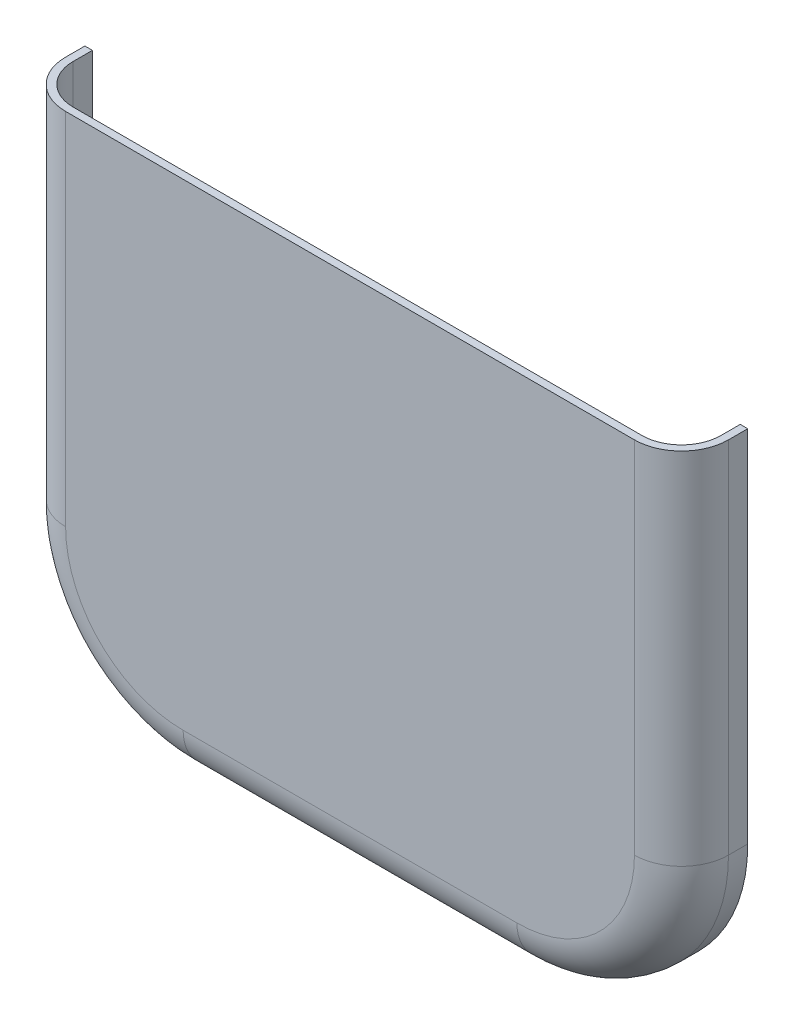
ISO-10303-21;
HEADER;
FILE_DESCRIPTION(('STEP AP214'),'2;1');
FILE_NAME('part.step','',(''),(''),'','','');
FILE_SCHEMA(('AUTOMOTIVE_DESIGN { 1 0 10303 214 1 1 1 1 }'));
ENDSEC;
DATA;
#1=APPLICATION_CONTEXT('core data for automotive mechanical design processes');
#2=APPLICATION_PROTOCOL_DEFINITION('international standard','automotive_design',2000,#1);
#3=PRODUCT_CONTEXT('',#1,'mechanical');
#4=PRODUCT('Part','Part','',(#3));
#5=PRODUCT_RELATED_PRODUCT_CATEGORY('part','',(#4));
#6=PRODUCT_DEFINITION_FORMATION('','',#4);
#7=PRODUCT_DEFINITION_CONTEXT('part definition',#1,'design');
#8=PRODUCT_DEFINITION('design','',#6,#7);
#9=PRODUCT_DEFINITION_SHAPE('','',#8);
#10=(LENGTH_UNIT() NAMED_UNIT(*) SI_UNIT(.MILLI.,.METRE.));
#11=(NAMED_UNIT(*) PLANE_ANGLE_UNIT() SI_UNIT($,.RADIAN.));
#12=(NAMED_UNIT(*) SI_UNIT($,.STERADIAN.) SOLID_ANGLE_UNIT());
#13=UNCERTAINTY_MEASURE_WITH_UNIT(LENGTH_MEASURE(1.E-05),#10,'distance_accuracy_value','');
#14=(GEOMETRIC_REPRESENTATION_CONTEXT(3) GLOBAL_UNCERTAINTY_ASSIGNED_CONTEXT((#13)) GLOBAL_UNIT_ASSIGNED_CONTEXT((#10,
#11,#12)) REPRESENTATION_CONTEXT('',''));
#15=CARTESIAN_POINT('',(0.,0.,0.));
#16=DIRECTION('',(0.,0.,1.));
#17=DIRECTION('',(1.,0.,0.));
#18=AXIS2_PLACEMENT_3D('',#15,#16,#17);
#19=CARTESIAN_POINT('',(-15.748,-16.51,7.1628));
#20=DIRECTION('',(0.,1.,0.));
#21=DIRECTION('',(-1.,0.,0.));
#22=AXIS2_PLACEMENT_3D('',#19,#20,#21);
#23=PLANE('',#22);
#24=DIRECTION('',(1.,0.,0.));
#25=VECTOR('',#24,1.);
#26=CARTESIAN_POINT('',(-15.748,-16.51,3.5814));
#27=LINE('',#26,#25);
#28=CARTESIAN_POINT('',(-6.858,-16.51,3.5814));
#29=VERTEX_POINT('',#28);
#30=CARTESIAN_POINT('',(11.176,-16.51,3.5814));
#31=VERTEX_POINT('',#30);
#32=EDGE_CURVE('E182',#29,#31,#27,.T.);
#33=ORIENTED_EDGE('',*,*,#32,.T.);
#34=DIRECTION('',(0.,0.,-1.));
#35=VECTOR('',#34,1.);
#36=CARTESIAN_POINT('',(11.176,-16.51,7.1628));
#37=LINE('',#36,#35);
#38=CARTESIAN_POINT('',(11.176,-16.51,4.6228));
#39=VERTEX_POINT('',#38);
#40=EDGE_CURVE('E290',#39,#31,#37,.T.);
#41=ORIENTED_EDGE('',*,*,#40,.F.);
#42=DIRECTION('',(1.,0.,0.));
#43=VECTOR('',#42,1.);
#44=CARTESIAN_POINT('',(-6.858,-16.51,4.6228));
#45=LINE('',#44,#43);
#46=CARTESIAN_POINT('',(-6.858,-16.51,4.6228));
#47=VERTEX_POINT('',#46);
#48=EDGE_CURVE('E195',#39,#47,#45,.F.);
#49=ORIENTED_EDGE('',*,*,#48,.T.);
#50=DIRECTION('',(0.,0.,-1.));
#51=VECTOR('',#50,1.);
#52=CARTESIAN_POINT('',(-6.858,-16.51,7.1628));
#53=LINE('',#52,#51);
#54=EDGE_CURVE('E240',#47,#29,#53,.T.);
#55=ORIENTED_EDGE('',*,*,#54,.T.);
#56=EDGE_LOOP('',(#33,#41,#49,#55));
#57=FACE_BOUND('',#56,.T.);
#58=ADVANCED_FACE('F35',(#57),#23,.F.);
#59=CARTESIAN_POINT('',(0.,0.,7.1628));
#60=DIRECTION('',(0.,0.,1.));
#61=DIRECTION('',(1.,0.,0.));
#62=AXIS2_PLACEMENT_3D('',#59,#60,#61);
#63=PLANE('',#62);
#64=DIRECTION('',(1.,0.,0.));
#65=VECTOR('',#64,1.);
#66=CARTESIAN_POINT('',(-15.748,11.811,7.1628));
#67=LINE('',#66,#65);
#68=CARTESIAN_POINT('',(-13.208,11.811,7.1628));
#69=VERTEX_POINT('',#68);
#70=CARTESIAN_POINT('',(17.526,11.811,7.1628));
#71=VERTEX_POINT('',#70);
#72=EDGE_CURVE('E322',#69,#71,#67,.T.);
#73=ORIENTED_EDGE('',*,*,#72,.F.);
#74=DIRECTION('',(0.,-1.,0.));
#75=VECTOR('',#74,1.);
#76=CARTESIAN_POINT('',(-13.208,-7.62,7.1628));
#77=LINE('',#76,#75);
#78=CARTESIAN_POINT('',(-13.208,-7.62,7.1628));
#79=VERTEX_POINT('',#78);
#80=EDGE_CURVE('E242',#69,#79,#77,.T.);
#81=ORIENTED_EDGE('',*,*,#80,.T.);
#82=CARTESIAN_POINT('',(-6.858,-7.62,7.1628));
#83=DIRECTION('',(0.,0.,1.));
#84=DIRECTION('',(1.,0.,0.));
#85=AXIS2_PLACEMENT_3D('',#82,#83,#84);
#86=CIRCLE('',#85,6.35);
#87=CARTESIAN_POINT('',(-6.858,-13.97,7.1628));
#88=VERTEX_POINT('',#87);
#89=EDGE_CURVE('E251',#79,#88,#86,.T.);
#90=ORIENTED_EDGE('',*,*,#89,.T.);
#91=DIRECTION('',(1.,0.,0.));
#92=VECTOR('',#91,1.);
#93=CARTESIAN_POINT('',(6.858,-13.97,7.1628));
#94=LINE('',#93,#92);
#95=CARTESIAN_POINT('',(11.176,-13.97,7.1628));
#96=VERTEX_POINT('',#95);
#97=EDGE_CURVE('E248',#88,#96,#94,.T.);
#98=ORIENTED_EDGE('',*,*,#97,.T.);
#99=CARTESIAN_POINT('',(11.176,-7.62,7.1628));
#100=DIRECTION('',(0.,0.,-1.));
#101=DIRECTION('',(-1.,0.,0.));
#102=AXIS2_PLACEMENT_3D('',#99,#100,#101);
#103=CIRCLE('',#102,6.35);
#104=CARTESIAN_POINT('',(17.526,-7.62,7.1628));
#105=VERTEX_POINT('',#104);
#106=EDGE_CURVE('E303',#105,#96,#103,.T.);
#107=ORIENTED_EDGE('',*,*,#106,.F.);
#108=DIRECTION('',(0.,-1.,0.));
#109=VECTOR('',#108,1.);
#110=CARTESIAN_POINT('',(17.526,-7.62,7.1628));
#111=LINE('',#110,#109);
#112=EDGE_CURVE('E293',#71,#105,#111,.T.);
#113=ORIENTED_EDGE('',*,*,#112,.F.);
#114=EDGE_LOOP('',(#73,#81,#90,#98,#107,#113));
#115=FACE_BOUND('',#114,.T.);
#116=ADVANCED_FACE('F353',(#115),#63,.T.);
#117=CARTESIAN_POINT('',(0.,-13.97,4.6228));
#118=DIRECTION('',(-1.,0.,0.));
#119=DIRECTION('',(0.,-1.,0.));
#120=AXIS2_PLACEMENT_3D('',#117,#118,#119);
#121=CYLINDRICAL_SURFACE('',#120,2.54);
#122=ORIENTED_EDGE('',*,*,#48,.F.);
#123=CARTESIAN_POINT('',(11.176,-13.97,4.6228));
#124=DIRECTION('',(1.,0.,0.));
#125=DIRECTION('',(0.,0.,-1.));
#126=AXIS2_PLACEMENT_3D('',#123,#124,#125);
#127=CIRCLE('',#126,2.54);
#128=EDGE_CURVE('E279',#96,#39,#127,.T.);
#129=ORIENTED_EDGE('',*,*,#128,.F.);
#130=ORIENTED_EDGE('',*,*,#97,.F.);
#131=CARTESIAN_POINT('',(-6.858,-13.97,4.6228));
#132=DIRECTION('',(1.,0.,0.));
#133=DIRECTION('',(0.,0.,-1.));
#134=AXIS2_PLACEMENT_3D('',#131,#132,#133);
#135=CIRCLE('',#134,2.54);
#136=EDGE_CURVE('E215',#88,#47,#135,.T.);
#137=ORIENTED_EDGE('',*,*,#136,.T.);
#138=EDGE_LOOP('',(#122,#129,#130,#137));
#139=FACE_BOUND('',#138,.T.);
#140=ADVANCED_FACE('F344',(#139),#121,.T.);
#141=CARTESIAN_POINT('',(-15.748,-16.1036,7.1628));
#142=DIRECTION('',(0.,1.,0.));
#143=DIRECTION('',(-1.,0.,0.));
#144=AXIS2_PLACEMENT_3D('',#141,#142,#143);
#145=PLANE('',#144);
#146=DIRECTION('',(-1.,0.,0.));
#147=VECTOR('',#146,1.);
#148=CARTESIAN_POINT('',(-15.748,-16.1036,4.6228));
#149=LINE('',#148,#147);
#150=CARTESIAN_POINT('',(11.176,-16.1036,4.6228));
#151=VERTEX_POINT('',#150);
#152=CARTESIAN_POINT('',(-6.858,-16.1036,4.6228));
#153=VERTEX_POINT('',#152);
#154=EDGE_CURVE('E196',#151,#153,#149,.T.);
#155=ORIENTED_EDGE('',*,*,#154,.F.);
#156=DIRECTION('',(0.,0.,1.));
#157=VECTOR('',#156,1.);
#158=CARTESIAN_POINT('',(11.176,-16.1036,7.1628));
#159=LINE('',#158,#157);
#160=CARTESIAN_POINT('',(11.176,-16.1036,3.5814));
#161=VERTEX_POINT('',#160);
#162=EDGE_CURVE('E261',#151,#161,#159,.F.);
#163=ORIENTED_EDGE('',*,*,#162,.T.);
#164=DIRECTION('',(1.,0.,0.));
#165=VECTOR('',#164,1.);
#166=CARTESIAN_POINT('',(-15.748,-16.1036,3.5814));
#167=LINE('',#166,#165);
#168=CARTESIAN_POINT('',(-6.858,-16.1036,3.5814));
#169=VERTEX_POINT('',#168);
#170=EDGE_CURVE('E191',#169,#161,#167,.T.);
#171=ORIENTED_EDGE('',*,*,#170,.F.);
#172=DIRECTION('',(0.,0.,1.));
#173=VECTOR('',#172,1.);
#174=CARTESIAN_POINT('',(-6.858,-16.1036,7.1628));
#175=LINE('',#174,#173);
#176=EDGE_CURVE('E194',#153,#169,#175,.F.);
#177=ORIENTED_EDGE('',*,*,#176,.F.);
#178=EDGE_LOOP('',(#155,#163,#171,#177));
#179=FACE_BOUND('',#178,.T.);
#180=ADVANCED_FACE('F378',(#179),#145,.T.);
#181=CARTESIAN_POINT('',(0.,0.,6.7564));
#182=DIRECTION('',(0.,0.,1.));
#183=DIRECTION('',(1.,0.,0.));
#184=AXIS2_PLACEMENT_3D('',#181,#182,#183);
#185=PLANE('',#184);
#186=DIRECTION('',(0.,1.,0.));
#187=VECTOR('',#186,1.);
#188=CARTESIAN_POINT('',(-13.208,0.,6.7564));
#189=LINE('',#188,#187);
#190=CARTESIAN_POINT('',(-13.208,11.811,6.7564));
#191=VERTEX_POINT('',#190);
#192=CARTESIAN_POINT('',(-13.208,-7.62,6.7564));
#193=VERTEX_POINT('',#192);
#194=EDGE_CURVE('E209',#191,#193,#189,.F.);
#195=ORIENTED_EDGE('',*,*,#194,.F.);
#196=DIRECTION('',(1.,0.,0.));
#197=VECTOR('',#196,1.);
#198=CARTESIAN_POINT('',(0.,11.811,6.7564));
#199=LINE('',#198,#197);
#200=CARTESIAN_POINT('',(17.526,11.811,6.7564));
#201=VERTEX_POINT('',#200);
#202=EDGE_CURVE('E316',#191,#201,#199,.T.);
#203=ORIENTED_EDGE('',*,*,#202,.T.);
#204=DIRECTION('',(0.,1.,0.));
#205=VECTOR('',#204,1.);
#206=CARTESIAN_POINT('',(17.526,0.,6.7564));
#207=LINE('',#206,#205);
#208=CARTESIAN_POINT('',(17.526,-7.62,6.7564));
#209=VERTEX_POINT('',#208);
#210=EDGE_CURVE('E276',#201,#209,#207,.F.);
#211=ORIENTED_EDGE('',*,*,#210,.T.);
#212=CARTESIAN_POINT('',(11.176,-7.62,6.7564));
#213=DIRECTION('',(0.,0.,-1.));
#214=DIRECTION('',(-1.,0.,0.));
#215=AXIS2_PLACEMENT_3D('',#212,#213,#214);
#216=CIRCLE('',#215,6.35);
#217=CARTESIAN_POINT('',(11.176,-13.97,6.7564));
#218=VERTEX_POINT('',#217);
#219=EDGE_CURVE('E285',#209,#218,#216,.T.);
#220=ORIENTED_EDGE('',*,*,#219,.T.);
#221=DIRECTION('',(1.,0.,0.));
#222=VECTOR('',#221,1.);
#223=CARTESIAN_POINT('',(0.,-13.97,6.7564));
#224=LINE('',#223,#222);
#225=CARTESIAN_POINT('',(-6.858,-13.97,6.7564));
#226=VERTEX_POINT('',#225);
#227=EDGE_CURVE('E199',#226,#218,#224,.T.);
#228=ORIENTED_EDGE('',*,*,#227,.F.);
#229=CARTESIAN_POINT('',(-6.858,-7.62,6.7564));
#230=DIRECTION('',(0.,0.,1.));
#231=DIRECTION('',(1.,0.,0.));
#232=AXIS2_PLACEMENT_3D('',#229,#230,#231);
#233=CIRCLE('',#232,6.35);
#234=EDGE_CURVE('E236',#193,#226,#233,.T.);
#235=ORIENTED_EDGE('',*,*,#234,.F.);
#236=EDGE_LOOP('',(#195,#203,#211,#220,#228,#235));
#237=FACE_BOUND('',#236,.T.);
#238=ADVANCED_FACE('F385',(#237),#185,.F.);
#239=CARTESIAN_POINT('',(0.,-13.97,4.6228));
#240=DIRECTION('',(-1.,0.,0.));
#241=DIRECTION('',(0.,-1.,0.));
#242=AXIS2_PLACEMENT_3D('',#239,#240,#241);
#243=CYLINDRICAL_SURFACE('',#242,2.1336);
#244=ORIENTED_EDGE('',*,*,#227,.T.);
#245=CARTESIAN_POINT('',(11.176,-13.97,4.6228));
#246=DIRECTION('',(-1.,0.,0.));
#247=DIRECTION('',(0.,-1.,0.));
#248=AXIS2_PLACEMENT_3D('',#245,#246,#247);
#249=CIRCLE('',#248,2.1336);
#250=EDGE_CURVE('E282',#218,#151,#249,.F.);
#251=ORIENTED_EDGE('',*,*,#250,.T.);
#252=ORIENTED_EDGE('',*,*,#154,.T.);
#253=CARTESIAN_POINT('',(-6.858,-13.97,4.6228));
#254=DIRECTION('',(-1.,0.,0.));
#255=DIRECTION('',(0.,-1.,0.));
#256=AXIS2_PLACEMENT_3D('',#253,#254,#255);
#257=CIRCLE('',#256,2.1336);
#258=EDGE_CURVE('E213',#226,#153,#257,.F.);
#259=ORIENTED_EDGE('',*,*,#258,.F.);
#260=EDGE_LOOP('',(#244,#251,#252,#259));
#261=FACE_BOUND('',#260,.T.);
#262=ADVANCED_FACE('F382',(#261),#243,.F.);
#263=CARTESIAN_POINT('',(-17.2974,16.51,3.5814));
#264=DIRECTION('',(0.,0.,1.));
#265=DIRECTION('',(0.,-1.,0.));
#266=AXIS2_PLACEMENT_3D('',#263,#264,#265);
#267=PLANE('',#266);
#268=DIRECTION('',(0.,-1.,0.));
#269=VECTOR('',#268,1.);
#270=CARTESIAN_POINT('',(-15.748,16.51,3.5814));
#271=LINE('',#270,#269);
#272=CARTESIAN_POINT('',(-15.748,11.811,3.5814));
#273=VERTEX_POINT('',#272);
#274=CARTESIAN_POINT('',(-15.748,-7.62,3.5814));
#275=VERTEX_POINT('',#274);
#276=EDGE_CURVE('E170',#273,#275,#271,.T.);
#277=ORIENTED_EDGE('',*,*,#276,.F.);
#278=DIRECTION('',(1.,0.,0.));
#279=VECTOR('',#278,1.);
#280=CARTESIAN_POINT('',(-15.748,11.811,3.5814));
#281=LINE('',#280,#279);
#282=CARTESIAN_POINT('',(-15.3416,11.811,3.5814));
#283=VERTEX_POINT('',#282);
#284=EDGE_CURVE('E156',#273,#283,#281,.T.);
#285=ORIENTED_EDGE('',*,*,#284,.T.);
#286=DIRECTION('',(0.,-1.,0.));
#287=VECTOR('',#286,1.);
#288=CARTESIAN_POINT('',(-15.3416,16.51,3.5814));
#289=LINE('',#288,#287);
#290=CARTESIAN_POINT('',(-15.3416,-7.62,3.5814));
#291=VERTEX_POINT('',#290);
#292=EDGE_CURVE('E42',#283,#291,#289,.T.);
#293=ORIENTED_EDGE('',*,*,#292,.T.);
#294=CARTESIAN_POINT('',(-6.858,-7.62,3.5814));
#295=DIRECTION('',(0.,0.,1.));
#296=DIRECTION('',(0.,-1.,0.));
#297=AXIS2_PLACEMENT_3D('',#294,#295,#296);
#298=CIRCLE('',#297,8.4836);
#299=EDGE_CURVE('E56',#169,#291,#298,.F.);
#300=ORIENTED_EDGE('',*,*,#299,.F.);
#301=ORIENTED_EDGE('',*,*,#170,.T.);
#302=CARTESIAN_POINT('',(11.176,-7.62,3.5814));
#303=DIRECTION('',(0.,0.,-1.));
#304=DIRECTION('',(0.,-1.,0.));
#305=AXIS2_PLACEMENT_3D('',#302,#303,#304);
#306=CIRCLE('',#305,8.4836);
#307=CARTESIAN_POINT('',(19.6596,-7.62,3.5814));
#308=VERTEX_POINT('',#307);
#309=EDGE_CURVE('E258',#161,#308,#306,.F.);
#310=ORIENTED_EDGE('',*,*,#309,.T.);
#311=DIRECTION('',(0.,-1.,0.));
#312=VECTOR('',#311,1.);
#313=CARTESIAN_POINT('',(19.6596,16.51,3.5814));
#314=LINE('',#313,#312);
#315=CARTESIAN_POINT('',(19.6596,11.811,3.5814));
#316=VERTEX_POINT('',#315);
#317=EDGE_CURVE('E184',#316,#308,#314,.T.);
#318=ORIENTED_EDGE('',*,*,#317,.F.);
#319=CARTESIAN_POINT('',(20.066,11.811,3.5814));
#320=VERTEX_POINT('',#319);
#321=EDGE_CURVE('E165',#316,#320,#281,.T.);
#322=ORIENTED_EDGE('',*,*,#321,.T.);
#323=DIRECTION('',(0.,-1.,0.));
#324=VECTOR('',#323,1.);
#325=CARTESIAN_POINT('',(20.066,16.51,3.5814));
#326=LINE('',#325,#324);
#327=CARTESIAN_POINT('',(20.066,-7.62,3.5814));
#328=VERTEX_POINT('',#327);
#329=EDGE_CURVE('E267',#320,#328,#326,.T.);
#330=ORIENTED_EDGE('',*,*,#329,.T.);
#331=CARTESIAN_POINT('',(11.176,-7.62,3.5814));
#332=DIRECTION('',(0.,0.,-1.));
#333=DIRECTION('',(0.,-1.,0.));
#334=AXIS2_PLACEMENT_3D('',#331,#332,#333);
#335=CIRCLE('',#334,8.89);
#336=EDGE_CURVE('E263',#31,#328,#335,.F.);
#337=ORIENTED_EDGE('',*,*,#336,.F.);
#338=ORIENTED_EDGE('',*,*,#32,.F.);
#339=CARTESIAN_POINT('',(-6.858,-7.62,3.5814));
#340=DIRECTION('',(0.,0.,1.));
#341=DIRECTION('',(0.,-1.,0.));
#342=AXIS2_PLACEMENT_3D('',#339,#340,#341);
#343=CIRCLE('',#342,8.89);
#344=EDGE_CURVE('E178',#29,#275,#343,.F.);
#345=ORIENTED_EDGE('',*,*,#344,.T.);
#346=EDGE_LOOP('',(#277,#285,#293,#300,#301,#310,#318,#322,#330,#337,#338,#345));
#347=FACE_BOUND('',#346,.T.);
#348=ADVANCED_FACE('F176',(#347),#267,.F.);
#349=CARTESIAN_POINT('',(-15.748,16.51,7.1628));
#350=DIRECTION('',(1.,0.,0.));
#351=DIRECTION('',(0.,1.,0.));
#352=AXIS2_PLACEMENT_3D('',#349,#350,#351);
#353=PLANE('',#352);
#354=DIRECTION('',(0.,-1.,0.));
#355=VECTOR('',#354,1.);
#356=CARTESIAN_POINT('',(-15.748,16.51,4.6228));
#357=LINE('',#356,#355);
#358=CARTESIAN_POINT('',(-15.748,-7.62,4.6228));
#359=VERTEX_POINT('',#358);
#360=CARTESIAN_POINT('',(-15.748,11.811,4.6228));
#361=VERTEX_POINT('',#360);
#362=EDGE_CURVE('E173',#359,#361,#357,.F.);
#363=ORIENTED_EDGE('',*,*,#362,.T.);
#364=DIRECTION('',(0.,0.,1.));
#365=VECTOR('',#364,1.);
#366=CARTESIAN_POINT('',(-15.748,11.811,3.5814));
#367=LINE('',#366,#365);
#368=EDGE_CURVE('E159',#273,#361,#367,.T.);
#369=ORIENTED_EDGE('',*,*,#368,.F.);
#370=ORIENTED_EDGE('',*,*,#276,.T.);
#371=DIRECTION('',(0.,0.,-1.));
#372=VECTOR('',#371,1.);
#373=CARTESIAN_POINT('',(-15.748,-7.62,7.1628));
#374=LINE('',#373,#372);
#375=EDGE_CURVE('E180',#275,#359,#374,.F.);
#376=ORIENTED_EDGE('',*,*,#375,.T.);
#377=EDGE_LOOP('',(#363,#369,#370,#376));
#378=FACE_BOUND('',#377,.T.);
#379=ADVANCED_FACE('F169',(#378),#353,.F.);
#380=CARTESIAN_POINT('',(-6.858,-7.62,7.1628));
#381=DIRECTION('',(0.,0.,-1.));
#382=DIRECTION('',(-1.,0.,0.));
#383=AXIS2_PLACEMENT_3D('',#380,#381,#382);
#384=CYLINDRICAL_SURFACE('',#383,8.89);
#385=ORIENTED_EDGE('',*,*,#344,.F.);
#386=ORIENTED_EDGE('',*,*,#54,.F.);
#387=CARTESIAN_POINT('',(-6.858,-7.62,4.6228));
#388=DIRECTION('',(0.,0.,1.));
#389=DIRECTION('',(1.,0.,0.));
#390=AXIS2_PLACEMENT_3D('',#387,#388,#389);
#391=CIRCLE('',#390,8.89);
#392=EDGE_CURVE('E244',#47,#359,#391,.F.);
#393=ORIENTED_EDGE('',*,*,#392,.T.);
#394=ORIENTED_EDGE('',*,*,#375,.F.);
#395=EDGE_LOOP('',(#385,#386,#393,#394));
#396=FACE_BOUND('',#395,.T.);
#397=ADVANCED_FACE('F340',(#396),#384,.T.);
#398=CARTESIAN_POINT('',(-13.208,0.,4.6228));
#399=DIRECTION('',(0.,1.,0.));
#400=DIRECTION('',(-1.,0.,0.));
#401=AXIS2_PLACEMENT_3D('',#398,#399,#400);
#402=CYLINDRICAL_SURFACE('',#401,2.54);
#403=CARTESIAN_POINT('',(-13.208,11.811,4.6228));
#404=DIRECTION('',(0.,-1.,0.));
#405=DIRECTION('',(1.,0.,0.));
#406=AXIS2_PLACEMENT_3D('',#403,#404,#405);
#407=CIRCLE('',#406,2.54);
#408=EDGE_CURVE('E298',#361,#69,#407,.F.);
#409=ORIENTED_EDGE('',*,*,#408,.F.);
#410=ORIENTED_EDGE('',*,*,#362,.F.);
#411=CARTESIAN_POINT('',(-13.208,-7.62,4.6228));
#412=DIRECTION('',(0.,-1.,0.));
#413=DIRECTION('',(0.,0.,-1.));
#414=AXIS2_PLACEMENT_3D('',#411,#412,#413);
#415=CIRCLE('',#414,2.54);
#416=EDGE_CURVE('E247',#79,#359,#415,.T.);
#417=ORIENTED_EDGE('',*,*,#416,.F.);
#418=ORIENTED_EDGE('',*,*,#80,.F.);
#419=EDGE_LOOP('',(#409,#410,#417,#418));
#420=FACE_BOUND('',#419,.T.);
#421=ADVANCED_FACE('F360',(#420),#402,.T.);
#422=CARTESIAN_POINT('',(-6.858,-7.62,4.6228));
#423=DIRECTION('',(0.,0.,1.));
#424=DIRECTION('',(1.,0.,0.));
#425=AXIS2_PLACEMENT_3D('',#422,#423,#424);
#426=TOROIDAL_SURFACE('',#425,6.35,2.54);
#427=ORIENTED_EDGE('',*,*,#416,.T.);
#428=ORIENTED_EDGE('',*,*,#392,.F.);
#429=ORIENTED_EDGE('',*,*,#136,.F.);
#430=ORIENTED_EDGE('',*,*,#89,.F.);
#431=EDGE_LOOP('',(#427,#428,#429,#430));
#432=FACE_BOUND('',#431,.T.);
#433=ADVANCED_FACE('F358',(#432),#426,.T.);
#434=CARTESIAN_POINT('',(-15.3416,16.51,7.1628));
#435=DIRECTION('',(1.,0.,0.));
#436=DIRECTION('',(0.,1.,0.));
#437=AXIS2_PLACEMENT_3D('',#434,#435,#436);
#438=PLANE('',#437);
#439=DIRECTION('',(0.,0.,-1.));
#440=VECTOR('',#439,1.);
#441=CARTESIAN_POINT('',(-15.3416,11.811,7.1628));
#442=LINE('',#441,#440);
#443=CARTESIAN_POINT('',(-15.3416,11.811,4.6228));
#444=VERTEX_POINT('',#443);
#445=EDGE_CURVE('E162',#444,#283,#442,.T.);
#446=ORIENTED_EDGE('',*,*,#445,.F.);
#447=DIRECTION('',(0.,1.,0.));
#448=VECTOR('',#447,1.);
#449=CARTESIAN_POINT('',(-15.3416,16.51,4.6228));
#450=LINE('',#449,#448);
#451=CARTESIAN_POINT('',(-15.3416,-7.62,4.6228));
#452=VERTEX_POINT('',#451);
#453=EDGE_CURVE('E216',#452,#444,#450,.T.);
#454=ORIENTED_EDGE('',*,*,#453,.F.);
#455=DIRECTION('',(0.,0.,1.));
#456=VECTOR('',#455,1.);
#457=CARTESIAN_POINT('',(-15.3416,-7.62,7.1628));
#458=LINE('',#457,#456);
#459=EDGE_CURVE('E188',#291,#452,#458,.T.);
#460=ORIENTED_EDGE('',*,*,#459,.F.);
#461=ORIENTED_EDGE('',*,*,#292,.F.);
#462=EDGE_LOOP('',(#446,#454,#460,#461));
#463=FACE_BOUND('',#462,.T.);
#464=ADVANCED_FACE('F233',(#463),#438,.T.);
#465=CARTESIAN_POINT('',(-6.858,-7.62,7.1628));
#466=DIRECTION('',(0.,0.,-1.));
#467=DIRECTION('',(-1.,0.,0.));
#468=AXIS2_PLACEMENT_3D('',#465,#466,#467);
#469=CYLINDRICAL_SURFACE('',#468,8.4836);
#470=ORIENTED_EDGE('',*,*,#176,.T.);
#471=ORIENTED_EDGE('',*,*,#299,.T.);
#472=ORIENTED_EDGE('',*,*,#459,.T.);
#473=CARTESIAN_POINT('',(-6.858,-7.62,4.6228));
#474=DIRECTION('',(0.,0.,-1.));
#475=DIRECTION('',(-1.,0.,0.));
#476=AXIS2_PLACEMENT_3D('',#473,#474,#475);
#477=CIRCLE('',#476,8.4836);
#478=EDGE_CURVE('E205',#153,#452,#477,.T.);
#479=ORIENTED_EDGE('',*,*,#478,.F.);
#480=EDGE_LOOP('',(#470,#471,#472,#479));
#481=FACE_BOUND('',#480,.T.);
#482=ADVANCED_FACE('F226',(#481),#469,.F.);
#483=CARTESIAN_POINT('',(-13.208,0.,4.6228));
#484=DIRECTION('',(0.,1.,0.));
#485=DIRECTION('',(-1.,0.,0.));
#486=AXIS2_PLACEMENT_3D('',#483,#484,#485);
#487=CYLINDRICAL_SURFACE('',#486,2.1336);
#488=ORIENTED_EDGE('',*,*,#453,.T.);
#489=CARTESIAN_POINT('',(-13.208,11.811,4.6228));
#490=DIRECTION('',(0.,-1.,0.));
#491=DIRECTION('',(1.,0.,0.));
#492=AXIS2_PLACEMENT_3D('',#489,#490,#491);
#493=CIRCLE('',#492,2.1336);
#494=EDGE_CURVE('E314',#444,#191,#493,.F.);
#495=ORIENTED_EDGE('',*,*,#494,.T.);
#496=ORIENTED_EDGE('',*,*,#194,.T.);
#497=CARTESIAN_POINT('',(-13.208,-7.62,4.6228));
#498=DIRECTION('',(0.,1.,0.));
#499=DIRECTION('',(-1.,0.,0.));
#500=AXIS2_PLACEMENT_3D('',#497,#498,#499);
#501=CIRCLE('',#500,2.1336);
#502=EDGE_CURVE('E222',#193,#452,#501,.F.);
#503=ORIENTED_EDGE('',*,*,#502,.T.);
#504=EDGE_LOOP('',(#488,#495,#496,#503));
#505=FACE_BOUND('',#504,.T.);
#506=ADVANCED_FACE('F234',(#505),#487,.F.);
#507=CARTESIAN_POINT('',(-6.858,-7.62,4.6228));
#508=DIRECTION('',(0.,0.,1.));
#509=DIRECTION('',(1.,0.,0.));
#510=AXIS2_PLACEMENT_3D('',#507,#508,#509);
#511=TOROIDAL_SURFACE('',#510,6.35,2.1336);
#512=ORIENTED_EDGE('',*,*,#502,.F.);
#513=ORIENTED_EDGE('',*,*,#234,.T.);
#514=ORIENTED_EDGE('',*,*,#258,.T.);
#515=ORIENTED_EDGE('',*,*,#478,.T.);
#516=EDGE_LOOP('',(#512,#513,#514,#515));
#517=FACE_BOUND('',#516,.T.);
#518=ADVANCED_FACE('F231',(#517),#511,.F.);
#519=CARTESIAN_POINT('',(20.066,16.51,7.1628));
#520=DIRECTION('',(-1.,0.,0.));
#521=DIRECTION('',(0.,1.,0.));
#522=AXIS2_PLACEMENT_3D('',#519,#520,#521);
#523=PLANE('',#522);
#524=ORIENTED_EDGE('',*,*,#329,.F.);
#525=DIRECTION('',(0.,0.,1.));
#526=VECTOR('',#525,1.);
#527=CARTESIAN_POINT('',(20.066,11.811,3.5814));
#528=LINE('',#527,#526);
#529=CARTESIAN_POINT('',(20.066,11.811,4.6228));
#530=VERTEX_POINT('',#529);
#531=EDGE_CURVE('E174',#320,#530,#528,.T.);
#532=ORIENTED_EDGE('',*,*,#531,.T.);
#533=DIRECTION('',(0.,-1.,0.));
#534=VECTOR('',#533,1.);
#535=CARTESIAN_POINT('',(20.066,16.51,4.6228));
#536=LINE('',#535,#534);
#537=CARTESIAN_POINT('',(20.066,-7.62,4.6228));
#538=VERTEX_POINT('',#537);
#539=EDGE_CURVE('E270',#538,#530,#536,.F.);
#540=ORIENTED_EDGE('',*,*,#539,.F.);
#541=DIRECTION('',(0.,0.,-1.));
#542=VECTOR('',#541,1.);
#543=CARTESIAN_POINT('',(20.066,-7.62,7.1628));
#544=LINE('',#543,#542);
#545=EDGE_CURVE('E269',#328,#538,#544,.F.);
#546=ORIENTED_EDGE('',*,*,#545,.F.);
#547=EDGE_LOOP('',(#524,#532,#540,#546));
#548=FACE_BOUND('',#547,.T.);
#549=ADVANCED_FACE('F331',(#548),#523,.F.);
#550=CARTESIAN_POINT('',(11.176,-7.62,7.1628));
#551=DIRECTION('',(0.,0.,-1.));
#552=DIRECTION('',(1.,0.,0.));
#553=AXIS2_PLACEMENT_3D('',#550,#551,#552);
#554=CYLINDRICAL_SURFACE('',#553,8.89);
#555=ORIENTED_EDGE('',*,*,#336,.T.);
#556=ORIENTED_EDGE('',*,*,#545,.T.);
#557=CARTESIAN_POINT('',(11.176,-7.62,4.6228));
#558=DIRECTION('',(0.,0.,-1.));
#559=DIRECTION('',(-1.,0.,0.));
#560=AXIS2_PLACEMENT_3D('',#557,#558,#559);
#561=CIRCLE('',#560,8.89);
#562=EDGE_CURVE('E299',#39,#538,#561,.F.);
#563=ORIENTED_EDGE('',*,*,#562,.F.);
#564=ORIENTED_EDGE('',*,*,#40,.T.);
#565=EDGE_LOOP('',(#555,#556,#563,#564));
#566=FACE_BOUND('',#565,.T.);
#567=ADVANCED_FACE('F335',(#566),#554,.T.);
#568=CARTESIAN_POINT('',(17.526,0.,4.6228));
#569=DIRECTION('',(0.,1.,0.));
#570=DIRECTION('',(1.,0.,0.));
#571=AXIS2_PLACEMENT_3D('',#568,#569,#570);
#572=CYLINDRICAL_SURFACE('',#571,2.54);
#573=CARTESIAN_POINT('',(17.526,11.811,4.6228));
#574=DIRECTION('',(0.,-1.,0.));
#575=DIRECTION('',(1.,0.,0.));
#576=AXIS2_PLACEMENT_3D('',#573,#574,#575);
#577=CIRCLE('',#576,2.54);
#578=EDGE_CURVE('E311',#71,#530,#577,.F.);
#579=ORIENTED_EDGE('',*,*,#578,.F.);
#580=ORIENTED_EDGE('',*,*,#112,.T.);
#581=CARTESIAN_POINT('',(17.526,-7.62,4.6228));
#582=DIRECTION('',(0.,1.,0.));
#583=DIRECTION('',(0.,0.,-1.));
#584=AXIS2_PLACEMENT_3D('',#581,#582,#583);
#585=CIRCLE('',#584,2.54);
#586=EDGE_CURVE('E302',#105,#538,#585,.T.);
#587=ORIENTED_EDGE('',*,*,#586,.T.);
#588=ORIENTED_EDGE('',*,*,#539,.T.);
#589=EDGE_LOOP('',(#579,#580,#587,#588));
#590=FACE_BOUND('',#589,.T.);
#591=ADVANCED_FACE('F432',(#590),#572,.T.);
#592=CARTESIAN_POINT('',(11.176,-7.62,4.6228));
#593=DIRECTION('',(0.,0.,1.));
#594=DIRECTION('',(-1.,0.,0.));
#595=AXIS2_PLACEMENT_3D('',#592,#593,#594);
#596=TOROIDAL_SURFACE('',#595,6.35,2.54);
#597=ORIENTED_EDGE('',*,*,#586,.F.);
#598=ORIENTED_EDGE('',*,*,#106,.T.);
#599=ORIENTED_EDGE('',*,*,#128,.T.);
#600=ORIENTED_EDGE('',*,*,#562,.T.);
#601=EDGE_LOOP('',(#597,#598,#599,#600));
#602=FACE_BOUND('',#601,.T.);
#603=ADVANCED_FACE('F349',(#602),#596,.T.);
#604=CARTESIAN_POINT('',(19.6596,16.51,7.1628));
#605=DIRECTION('',(-1.,0.,0.));
#606=DIRECTION('',(0.,1.,0.));
#607=AXIS2_PLACEMENT_3D('',#604,#605,#606);
#608=PLANE('',#607);
#609=DIRECTION('',(0.,0.,1.));
#610=VECTOR('',#609,1.);
#611=CARTESIAN_POINT('',(19.6596,11.811,7.1628));
#612=LINE('',#611,#610);
#613=CARTESIAN_POINT('',(19.6596,11.811,4.6228));
#614=VERTEX_POINT('',#613);
#615=EDGE_CURVE('E49',#316,#614,#612,.T.);
#616=ORIENTED_EDGE('',*,*,#615,.F.);
#617=ORIENTED_EDGE('',*,*,#317,.T.);
#618=DIRECTION('',(0.,0.,1.));
#619=VECTOR('',#618,1.);
#620=CARTESIAN_POINT('',(19.6596,-7.62,7.1628));
#621=LINE('',#620,#619);
#622=CARTESIAN_POINT('',(19.6596,-7.62,4.6228));
#623=VERTEX_POINT('',#622);
#624=EDGE_CURVE('E260',#308,#623,#621,.T.);
#625=ORIENTED_EDGE('',*,*,#624,.T.);
#626=DIRECTION('',(0.,1.,0.));
#627=VECTOR('',#626,1.);
#628=CARTESIAN_POINT('',(19.6596,16.51,4.6228));
#629=LINE('',#628,#627);
#630=EDGE_CURVE('E273',#623,#614,#629,.T.);
#631=ORIENTED_EDGE('',*,*,#630,.T.);
#632=EDGE_LOOP('',(#616,#617,#625,#631));
#633=FACE_BOUND('',#632,.T.);
#634=ADVANCED_FACE('F415',(#633),#608,.T.);
#635=CARTESIAN_POINT('',(11.176,-7.62,7.1628));
#636=DIRECTION('',(0.,0.,-1.));
#637=DIRECTION('',(1.,0.,0.));
#638=AXIS2_PLACEMENT_3D('',#635,#636,#637);
#639=CYLINDRICAL_SURFACE('',#638,8.4836);
#640=ORIENTED_EDGE('',*,*,#162,.F.);
#641=CARTESIAN_POINT('',(11.176,-7.62,4.6228));
#642=DIRECTION('',(0.,0.,1.));
#643=DIRECTION('',(1.,0.,0.));
#644=AXIS2_PLACEMENT_3D('',#641,#642,#643);
#645=CIRCLE('',#644,8.4836);
#646=EDGE_CURVE('E266',#151,#623,#645,.T.);
#647=ORIENTED_EDGE('',*,*,#646,.T.);
#648=ORIENTED_EDGE('',*,*,#624,.F.);
#649=ORIENTED_EDGE('',*,*,#309,.F.);
#650=EDGE_LOOP('',(#640,#647,#648,#649));
#651=FACE_BOUND('',#650,.T.);
#652=ADVANCED_FACE('F413',(#651),#639,.F.);
#653=CARTESIAN_POINT('',(17.526,0.,4.6228));
#654=DIRECTION('',(0.,1.,0.));
#655=DIRECTION('',(1.,0.,0.));
#656=AXIS2_PLACEMENT_3D('',#653,#654,#655);
#657=CYLINDRICAL_SURFACE('',#656,2.1336);
#658=ORIENTED_EDGE('',*,*,#210,.F.);
#659=CARTESIAN_POINT('',(17.526,11.811,4.6228));
#660=DIRECTION('',(0.,-1.,0.));
#661=DIRECTION('',(1.,0.,0.));
#662=AXIS2_PLACEMENT_3D('',#659,#660,#661);
#663=CIRCLE('',#662,2.1336);
#664=EDGE_CURVE('E12',#201,#614,#663,.F.);
#665=ORIENTED_EDGE('',*,*,#664,.T.);
#666=ORIENTED_EDGE('',*,*,#630,.F.);
#667=CARTESIAN_POINT('',(17.526,-7.62,4.6228));
#668=DIRECTION('',(0.,-1.,0.));
#669=DIRECTION('',(1.,0.,0.));
#670=AXIS2_PLACEMENT_3D('',#667,#668,#669);
#671=CIRCLE('',#670,2.1336);
#672=EDGE_CURVE('E284',#209,#623,#671,.F.);
#673=ORIENTED_EDGE('',*,*,#672,.F.);
#674=EDGE_LOOP('',(#658,#665,#666,#673));
#675=FACE_BOUND('',#674,.T.);
#676=ADVANCED_FACE('F418',(#675),#657,.F.);
#677=CARTESIAN_POINT('',(11.176,-7.62,4.6228));
#678=DIRECTION('',(0.,0.,1.));
#679=DIRECTION('',(-1.,0.,0.));
#680=AXIS2_PLACEMENT_3D('',#677,#678,#679);
#681=TOROIDAL_SURFACE('',#680,6.35,2.1336);
#682=ORIENTED_EDGE('',*,*,#672,.T.);
#683=ORIENTED_EDGE('',*,*,#646,.F.);
#684=ORIENTED_EDGE('',*,*,#250,.F.);
#685=ORIENTED_EDGE('',*,*,#219,.F.);
#686=EDGE_LOOP('',(#682,#683,#684,#685));
#687=FACE_BOUND('',#686,.T.);
#688=ADVANCED_FACE('F406',(#687),#681,.F.);
#689=CARTESIAN_POINT('',(-15.748,11.811,3.5814));
#690=DIRECTION('',(0.,-1.,0.));
#691=DIRECTION('',(1.,0.,0.));
#692=AXIS2_PLACEMENT_3D('',#689,#690,#691);
#693=PLANE('',#692);
#694=ORIENTED_EDGE('',*,*,#408,.T.);
#695=ORIENTED_EDGE('',*,*,#72,.T.);
#696=ORIENTED_EDGE('',*,*,#578,.T.);
#697=ORIENTED_EDGE('',*,*,#531,.F.);
#698=ORIENTED_EDGE('',*,*,#321,.F.);
#699=ORIENTED_EDGE('',*,*,#615,.T.);
#700=ORIENTED_EDGE('',*,*,#664,.F.);
#701=ORIENTED_EDGE('',*,*,#202,.F.);
#702=ORIENTED_EDGE('',*,*,#494,.F.);
#703=ORIENTED_EDGE('',*,*,#445,.T.);
#704=ORIENTED_EDGE('',*,*,#284,.F.);
#705=ORIENTED_EDGE('',*,*,#368,.T.);
#706=EDGE_LOOP('',(#694,#695,#696,#697,#698,#699,#700,#701,#702,#703,#704,#705));
#707=FACE_BOUND('',#706,.T.);
#708=ADVANCED_FACE('F158',(#707),#693,.F.);
#709=CLOSED_SHELL('',(#58,#116,#140,#180,#238,#262,#348,#379,#397,#421,#433,#464,#482,#506,#518,
#549,#567,#591,#603,#634,#652,#676,#688,#708));
#710=MANIFOLD_SOLID_BREP('B2',#709);
#711=ADVANCED_BREP_SHAPE_REPRESENTATION('',(#18,#710),#14);
#712=SHAPE_DEFINITION_REPRESENTATION(#9,#711);
ENDSEC;
END-ISO-10303-21;
